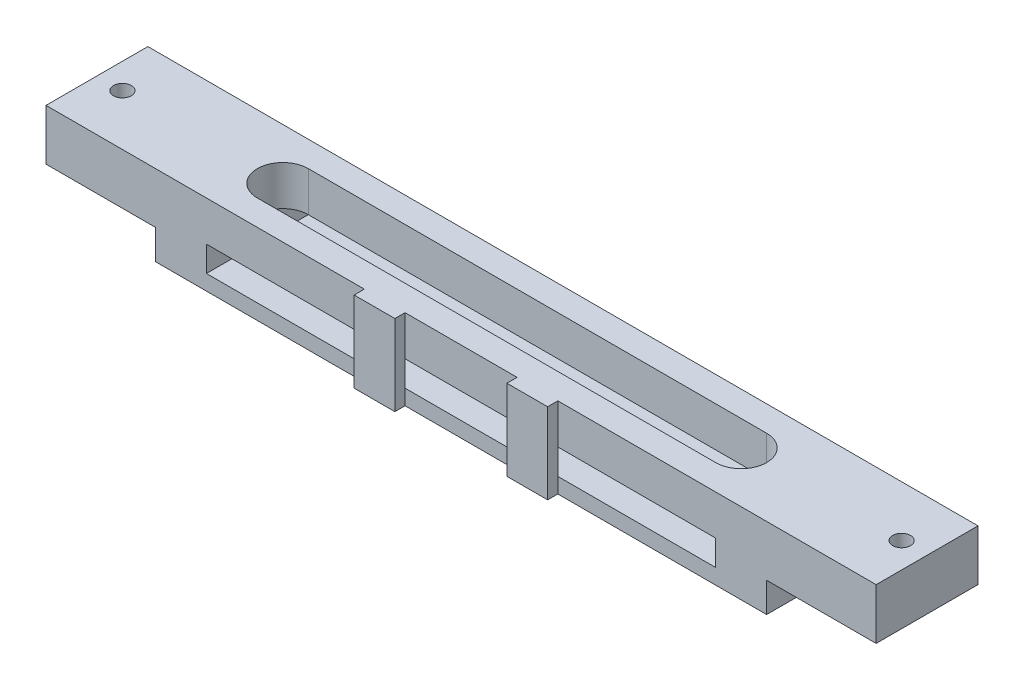
ISO-10303-21;
HEADER;
FILE_DESCRIPTION(('STEP AP214'),'2;1');
FILE_NAME('part.step','',(''),(''),'','','');
FILE_SCHEMA(('AUTOMOTIVE_DESIGN { 1 0 10303 214 1 1 1 1 }'));
ENDSEC;
DATA;
#1=APPLICATION_CONTEXT('core data for automotive mechanical design processes');
#2=APPLICATION_PROTOCOL_DEFINITION('international standard','automotive_design',2000,#1);
#3=PRODUCT_CONTEXT('',#1,'mechanical');
#4=PRODUCT('Part','Part','',(#3));
#5=PRODUCT_RELATED_PRODUCT_CATEGORY('part','',(#4));
#6=PRODUCT_DEFINITION_FORMATION('','',#4);
#7=PRODUCT_DEFINITION_CONTEXT('part definition',#1,'design');
#8=PRODUCT_DEFINITION('design','',#6,#7);
#9=PRODUCT_DEFINITION_SHAPE('','',#8);
#10=(LENGTH_UNIT() NAMED_UNIT(*) SI_UNIT(.MILLI.,.METRE.));
#11=(NAMED_UNIT(*) PLANE_ANGLE_UNIT() SI_UNIT($,.RADIAN.));
#12=(NAMED_UNIT(*) SI_UNIT($,.STERADIAN.) SOLID_ANGLE_UNIT());
#13=UNCERTAINTY_MEASURE_WITH_UNIT(LENGTH_MEASURE(1.E-05),#10,'distance_accuracy_value','');
#14=(GEOMETRIC_REPRESENTATION_CONTEXT(3) GLOBAL_UNCERTAINTY_ASSIGNED_CONTEXT((#13)) GLOBAL_UNIT_ASSIGNED_CONTEXT((#10,
#11,#12)) REPRESENTATION_CONTEXT('',''));
#15=CARTESIAN_POINT('',(0.,0.,0.));
#16=DIRECTION('',(0.,0.,1.));
#17=DIRECTION('',(1.,0.,0.));
#18=AXIS2_PLACEMENT_3D('',#15,#16,#17);
#19=CARTESIAN_POINT('',(0.,0.,20.));
#20=DIRECTION('',(0.,0.,-1.));
#21=DIRECTION('',(-1.,0.,0.));
#22=AXIS2_PLACEMENT_3D('',#19,#20,#21);
#23=PLANE('',#22);
#24=DIRECTION('',(0.,-1.,0.));
#25=VECTOR('',#24,1.);
#26=CARTESIAN_POINT('',(-19.,9.99999999999998,20.));
#27=LINE('',#26,#25);
#28=CARTESIAN_POINT('',(-19.,9.99999999999999,20.));
#29=VERTEX_POINT('',#28);
#30=CARTESIAN_POINT('',(-19.,2.15999999999999,20.));
#31=VERTEX_POINT('',#30);
#32=EDGE_CURVE('E52',#29,#31,#27,.T.);
#33=ORIENTED_EDGE('',*,*,#32,.F.);
#34=DIRECTION('',(-1.,0.,0.));
#35=VECTOR('',#34,1.);
#36=CARTESIAN_POINT('',(-81.5,10.,20.));
#37=LINE('',#36,#35);
#38=CARTESIAN_POINT('',(-81.5,10.,20.));
#39=VERTEX_POINT('',#38);
#40=EDGE_CURVE('E468',#29,#39,#37,.T.);
#41=ORIENTED_EDGE('',*,*,#40,.T.);
#42=DIRECTION('',(0.,-1.,0.));
#43=VECTOR('',#42,1.);
#44=CARTESIAN_POINT('',(-81.5,0.,20.));
#45=LINE('',#44,#43);
#46=CARTESIAN_POINT('',(-81.5,0.,20.));
#47=VERTEX_POINT('',#46);
#48=EDGE_CURVE('E458',#39,#47,#45,.T.);
#49=ORIENTED_EDGE('',*,*,#48,.T.);
#50=DIRECTION('',(1.,0.,0.));
#51=VECTOR('',#50,1.);
#52=CARTESIAN_POINT('',(81.5,0.,20.));
#53=LINE('',#52,#51);
#54=CARTESIAN_POINT('',(-60.,0.,20.));
#55=VERTEX_POINT('',#54);
#56=EDGE_CURVE('E463',#47,#55,#53,.T.);
#57=ORIENTED_EDGE('',*,*,#56,.T.);
#58=DIRECTION('',(0.,1.,0.));
#59=VECTOR('',#58,1.);
#60=CARTESIAN_POINT('',(-60.,-5.84000000000001,20.));
#61=LINE('',#60,#59);
#62=CARTESIAN_POINT('',(-60.,-5.84000000000001,20.));
#63=VERTEX_POINT('',#62);
#64=EDGE_CURVE('E451',#63,#55,#61,.T.);
#65=ORIENTED_EDGE('',*,*,#64,.F.);
#66=DIRECTION('',(-1.,0.,0.));
#67=VECTOR('',#66,1.);
#68=CARTESIAN_POINT('',(-60.,-5.84000000000001,20.));
#69=LINE('',#68,#67);
#70=CARTESIAN_POINT('',(-19.,-5.84,20.));
#71=VERTEX_POINT('',#70);
#72=EDGE_CURVE('E431',#71,#63,#69,.T.);
#73=ORIENTED_EDGE('',*,*,#72,.F.);
#74=CARTESIAN_POINT('',(-19.,-2.84000000000001,20.));
#75=VERTEX_POINT('',#74);
#76=EDGE_CURVE('E11',#75,#71,#27,.T.);
#77=ORIENTED_EDGE('',*,*,#76,.F.);
#78=DIRECTION('',(1.,0.,0.));
#79=VECTOR('',#78,1.);
#80=CARTESIAN_POINT('',(-50.,-2.84000000000001,20.));
#81=LINE('',#80,#79);
#82=CARTESIAN_POINT('',(-50.,-2.84000000000001,20.));
#83=VERTEX_POINT('',#82);
#84=EDGE_CURVE('E370',#83,#75,#81,.T.);
#85=ORIENTED_EDGE('',*,*,#84,.F.);
#86=DIRECTION('',(0.,-1.,0.));
#87=VECTOR('',#86,1.);
#88=CARTESIAN_POINT('',(-50.,2.15999999999999,20.));
#89=LINE('',#88,#87);
#90=CARTESIAN_POINT('',(-50.,2.15999999999999,20.));
#91=VERTEX_POINT('',#90);
#92=EDGE_CURVE('E360',#91,#83,#89,.T.);
#93=ORIENTED_EDGE('',*,*,#92,.F.);
#94=DIRECTION('',(-1.,0.,0.));
#95=VECTOR('',#94,1.);
#96=CARTESIAN_POINT('',(-50.,2.15999999999999,20.));
#97=LINE('',#96,#95);
#98=EDGE_CURVE('E366',#31,#91,#97,.T.);
#99=ORIENTED_EDGE('',*,*,#98,.F.);
#100=EDGE_LOOP('',(#33,#41,#49,#57,#65,#73,#77,#85,#93,#99));
#101=FACE_BOUND('',#100,.T.);
#102=ADVANCED_FACE('F41',(#101),#23,.F.);
#103=DIRECTION('',(0.,1.,0.));
#104=VECTOR('',#103,1.);
#105=CARTESIAN_POINT('',(-11.,9.99999999999998,20.));
#106=LINE('',#105,#104);
#107=CARTESIAN_POINT('',(-11.,-5.84,20.));
#108=VERTEX_POINT('',#107);
#109=CARTESIAN_POINT('',(-11.,-2.84000000000001,20.));
#110=VERTEX_POINT('',#109);
#111=EDGE_CURVE('E281',#108,#110,#106,.T.);
#112=ORIENTED_EDGE('',*,*,#111,.F.);
#113=CARTESIAN_POINT('',(11.,-5.84,20.));
#114=VERTEX_POINT('',#113);
#115=EDGE_CURVE('E437',#114,#108,#69,.T.);
#116=ORIENTED_EDGE('',*,*,#115,.F.);
#117=DIRECTION('',(0.,-1.,0.));
#118=VECTOR('',#117,1.);
#119=CARTESIAN_POINT('',(11.,9.99999999999998,20.));
#120=LINE('',#119,#118);
#121=CARTESIAN_POINT('',(11.,-2.84000000000001,20.));
#122=VERTEX_POINT('',#121);
#123=EDGE_CURVE('E313',#122,#114,#120,.T.);
#124=ORIENTED_EDGE('',*,*,#123,.F.);
#125=EDGE_CURVE('E539',#110,#122,#81,.T.);
#126=ORIENTED_EDGE('',*,*,#125,.F.);
#127=EDGE_LOOP('',(#112,#116,#124,#126));
#128=FACE_BOUND('',#127,.T.);
#129=ADVANCED_FACE('F571',(#128),#23,.F.);
#130=CARTESIAN_POINT('',(-11.,2.15999999999999,20.));
#131=VERTEX_POINT('',#130);
#132=CARTESIAN_POINT('',(-11.,9.99999999999998,20.));
#133=VERTEX_POINT('',#132);
#134=EDGE_CURVE('E50',#131,#133,#106,.T.);
#135=ORIENTED_EDGE('',*,*,#134,.F.);
#136=CARTESIAN_POINT('',(11.,2.15999999999999,20.));
#137=VERTEX_POINT('',#136);
#138=EDGE_CURVE('E513',#137,#131,#97,.T.);
#139=ORIENTED_EDGE('',*,*,#138,.F.);
#140=CARTESIAN_POINT('',(11.,9.99999999999999,20.));
#141=VERTEX_POINT('',#140);
#142=EDGE_CURVE('E67',#141,#137,#120,.T.);
#143=ORIENTED_EDGE('',*,*,#142,.F.);
#144=EDGE_CURVE('E472',#141,#133,#37,.T.);
#145=ORIENTED_EDGE('',*,*,#144,.T.);
#146=EDGE_LOOP('',(#135,#139,#143,#145));
#147=FACE_BOUND('',#146,.T.);
#148=ADVANCED_FACE('F553',(#147),#23,.F.);
#149=DIRECTION('',(0.,1.,0.));
#150=VECTOR('',#149,1.);
#151=CARTESIAN_POINT('',(19.,9.99999999999998,20.));
#152=LINE('',#151,#150);
#153=CARTESIAN_POINT('',(19.,-5.84,20.));
#154=VERTEX_POINT('',#153);
#155=CARTESIAN_POINT('',(19.,-2.84000000000001,20.));
#156=VERTEX_POINT('',#155);
#157=EDGE_CURVE('E306',#154,#156,#152,.T.);
#158=ORIENTED_EDGE('',*,*,#157,.F.);
#159=CARTESIAN_POINT('',(60.,-5.83999999999999,20.));
#160=VERTEX_POINT('',#159);
#161=EDGE_CURVE('E433',#160,#154,#69,.T.);
#162=ORIENTED_EDGE('',*,*,#161,.F.);
#163=DIRECTION('',(0.,1.,0.));
#164=VECTOR('',#163,1.);
#165=CARTESIAN_POINT('',(60.,-5.83999999999999,20.));
#166=LINE('',#165,#164);
#167=CARTESIAN_POINT('',(60.,0.,20.));
#168=VERTEX_POINT('',#167);
#169=EDGE_CURVE('E454',#160,#168,#166,.T.);
#170=ORIENTED_EDGE('',*,*,#169,.T.);
#171=CARTESIAN_POINT('',(81.5,0.,20.));
#172=VERTEX_POINT('',#171);
#173=EDGE_CURVE('E461',#168,#172,#53,.T.);
#174=ORIENTED_EDGE('',*,*,#173,.T.);
#175=DIRECTION('',(0.,1.,0.));
#176=VECTOR('',#175,1.);
#177=CARTESIAN_POINT('',(81.5,0.,20.));
#178=LINE('',#177,#176);
#179=CARTESIAN_POINT('',(81.5,9.99999999999998,20.));
#180=VERTEX_POINT('',#179);
#181=EDGE_CURVE('E466',#172,#180,#178,.T.);
#182=ORIENTED_EDGE('',*,*,#181,.T.);
#183=CARTESIAN_POINT('',(19.,9.99999999999998,20.));
#184=VERTEX_POINT('',#183);
#185=EDGE_CURVE('E469',#180,#184,#37,.T.);
#186=ORIENTED_EDGE('',*,*,#185,.T.);
#187=CARTESIAN_POINT('',(19.,2.15999999999999,20.));
#188=VERTEX_POINT('',#187);
#189=EDGE_CURVE('E311',#188,#184,#152,.T.);
#190=ORIENTED_EDGE('',*,*,#189,.F.);
#191=CARTESIAN_POINT('',(50.,2.15999999999999,20.));
#192=VERTEX_POINT('',#191);
#193=EDGE_CURVE('E361',#192,#188,#97,.T.);
#194=ORIENTED_EDGE('',*,*,#193,.F.);
#195=DIRECTION('',(0.,1.,0.));
#196=VECTOR('',#195,1.);
#197=CARTESIAN_POINT('',(50.,2.15999999999999,20.));
#198=LINE('',#197,#196);
#199=CARTESIAN_POINT('',(50.,-2.84000000000001,20.));
#200=VERTEX_POINT('',#199);
#201=EDGE_CURVE('E367',#200,#192,#198,.T.);
#202=ORIENTED_EDGE('',*,*,#201,.F.);
#203=EDGE_CURVE('E374',#156,#200,#81,.T.);
#204=ORIENTED_EDGE('',*,*,#203,.F.);
#205=EDGE_LOOP('',(#158,#162,#170,#174,#182,#186,#190,#194,#202,#204));
#206=FACE_BOUND('',#205,.T.);
#207=ADVANCED_FACE('F581',(#206),#23,.F.);
#208=CARTESIAN_POINT('',(-50.,2.15999999999999,-100.124921972504));
#209=DIRECTION('',(0.,1.,0.));
#210=DIRECTION('',(0.,0.,1.));
#211=AXIS2_PLACEMENT_3D('',#208,#209,#210);
#212=PLANE('',#211);
#213=DIRECTION('',(1.,0.,0.));
#214=VECTOR('',#213,1.);
#215=CARTESIAN_POINT('',(-45.,2.15999999999999,5.));
#216=LINE('',#215,#214);
#217=CARTESIAN_POINT('',(-45.,2.15999999999999,4.99999999999999));
#218=VERTEX_POINT('',#217);
#219=CARTESIAN_POINT('',(45.,2.15999999999999,5.));
#220=VERTEX_POINT('',#219);
#221=EDGE_CURVE('E330',#218,#220,#216,.T.);
#222=ORIENTED_EDGE('',*,*,#221,.F.);
#223=CARTESIAN_POINT('',(-45.,2.15999999999999,10.));
#224=DIRECTION('',(0.,-1.,0.));
#225=DIRECTION('',(0.,0.,-1.));
#226=AXIS2_PLACEMENT_3D('',#223,#224,#225);
#227=CIRCLE('',#226,4.99999999999999);
#228=CARTESIAN_POINT('',(-50.,2.15999999999999,10.));
#229=VERTEX_POINT('',#228);
#230=EDGE_CURVE('E327',#229,#218,#227,.T.);
#231=ORIENTED_EDGE('',*,*,#230,.F.);
#232=DIRECTION('',(0.,0.,1.));
#233=VECTOR('',#232,1.);
#234=CARTESIAN_POINT('',(-50.,2.15999999999999,-100.124921972504));
#235=LINE('',#234,#233);
#236=CARTESIAN_POINT('',(-50.,2.15999999999999,0.));
#237=VERTEX_POINT('',#236);
#238=EDGE_CURVE('E384',#237,#229,#235,.T.);
#239=ORIENTED_EDGE('',*,*,#238,.F.);
#240=DIRECTION('',(-1.,0.,0.));
#241=VECTOR('',#240,1.);
#242=CARTESIAN_POINT('',(-50.,2.15999999999999,0.));
#243=LINE('',#242,#241);
#244=CARTESIAN_POINT('',(50.,2.15999999999999,0.));
#245=VERTEX_POINT('',#244);
#246=EDGE_CURVE('E385',#245,#237,#243,.T.);
#247=ORIENTED_EDGE('',*,*,#246,.F.);
#248=DIRECTION('',(0.,0.,1.));
#249=VECTOR('',#248,1.);
#250=CARTESIAN_POINT('',(50.,2.15999999999999,-100.124921972504));
#251=LINE('',#250,#249);
#252=CARTESIAN_POINT('',(50.,2.15999999999999,10.));
#253=VERTEX_POINT('',#252);
#254=EDGE_CURVE('E389',#245,#253,#251,.T.);
#255=ORIENTED_EDGE('',*,*,#254,.T.);
#256=CARTESIAN_POINT('',(45.,2.15999999999999,10.));
#257=DIRECTION('',(0.,-1.,0.));
#258=DIRECTION('',(0.,0.,-1.));
#259=AXIS2_PLACEMENT_3D('',#256,#257,#258);
#260=CIRCLE('',#259,5.);
#261=EDGE_CURVE('E334',#220,#253,#260,.T.);
#262=ORIENTED_EDGE('',*,*,#261,.F.);
#263=EDGE_LOOP('',(#222,#231,#239,#247,#255,#262));
#264=FACE_BOUND('',#263,.T.);
#265=ADVANCED_FACE('F588',(#264),#212,.F.);
#266=CARTESIAN_POINT('',(81.5,0.,20.));
#267=DIRECTION('',(0.,1.,0.));
#268=DIRECTION('',(-1.,0.,0.));
#269=AXIS2_PLACEMENT_3D('',#266,#267,#268);
#270=PLANE('',#269);
#271=CARTESIAN_POINT('',(76.5,0.,10.));
#272=DIRECTION('',(0.,1.,0.));
#273=DIRECTION('',(-1.,0.,0.));
#274=AXIS2_PLACEMENT_3D('',#271,#272,#273);
#275=CIRCLE('',#274,1.75);
#276=CARTESIAN_POINT('',(74.75,0.,10.));
#277=VERTEX_POINT('',#276);
#278=EDGE_CURVE('E324',#277,#277,#275,.T.);
#279=ORIENTED_EDGE('',*,*,#278,.T.);
#280=EDGE_LOOP('',(#279));
#281=FACE_BOUND('',#280,.T.);
#282=DIRECTION('',(0.,0.,1.));
#283=VECTOR('',#282,1.);
#284=CARTESIAN_POINT('',(60.,0.,20.));
#285=LINE('',#284,#283);
#286=CARTESIAN_POINT('',(60.,0.,0.));
#287=VERTEX_POINT('',#286);
#288=EDGE_CURVE('E428',#287,#168,#285,.T.);
#289=ORIENTED_EDGE('',*,*,#288,.F.);
#290=DIRECTION('',(1.,0.,0.));
#291=VECTOR('',#290,1.);
#292=CARTESIAN_POINT('',(81.5,0.,0.));
#293=LINE('',#292,#291);
#294=CARTESIAN_POINT('',(81.5,0.,0.));
#295=VERTEX_POINT('',#294);
#296=EDGE_CURVE('E475',#287,#295,#293,.T.);
#297=ORIENTED_EDGE('',*,*,#296,.T.);
#298=DIRECTION('',(0.,0.,-1.));
#299=VECTOR('',#298,1.);
#300=CARTESIAN_POINT('',(81.5,0.,20.));
#301=LINE('',#300,#299);
#302=EDGE_CURVE('E486',#172,#295,#301,.T.);
#303=ORIENTED_EDGE('',*,*,#302,.F.);
#304=ORIENTED_EDGE('',*,*,#173,.F.);
#305=EDGE_LOOP('',(#289,#297,#303,#304));
#306=FACE_BOUND('',#305,.T.);
#307=ADVANCED_FACE('F616',(#281,#306),#270,.F.);
#308=CARTESIAN_POINT('',(-76.5,0.,10.));
#309=DIRECTION('',(0.,1.,0.));
#310=DIRECTION('',(-1.,0.,0.));
#311=AXIS2_PLACEMENT_3D('',#308,#309,#310);
#312=CIRCLE('',#311,1.75);
#313=CARTESIAN_POINT('',(-78.25,0.,10.));
#314=VERTEX_POINT('',#313);
#315=EDGE_CURVE('E288',#314,#314,#312,.T.);
#316=ORIENTED_EDGE('',*,*,#315,.T.);
#317=EDGE_LOOP('',(#316));
#318=FACE_BOUND('',#317,.T.);
#319=DIRECTION('',(0.,0.,-1.));
#320=VECTOR('',#319,1.);
#321=CARTESIAN_POINT('',(-60.,0.,20.));
#322=LINE('',#321,#320);
#323=CARTESIAN_POINT('',(-60.,0.,0.));
#324=VERTEX_POINT('',#323);
#325=EDGE_CURVE('E432',#55,#324,#322,.T.);
#326=ORIENTED_EDGE('',*,*,#325,.F.);
#327=ORIENTED_EDGE('',*,*,#56,.F.);
#328=DIRECTION('',(0.,0.,-1.));
#329=VECTOR('',#328,1.);
#330=CARTESIAN_POINT('',(-81.5,0.,20.));
#331=LINE('',#330,#329);
#332=CARTESIAN_POINT('',(-81.5,0.,0.));
#333=VERTEX_POINT('',#332);
#334=EDGE_CURVE('E489',#47,#333,#331,.T.);
#335=ORIENTED_EDGE('',*,*,#334,.T.);
#336=EDGE_CURVE('E476',#333,#324,#293,.T.);
#337=ORIENTED_EDGE('',*,*,#336,.T.);
#338=EDGE_LOOP('',(#326,#327,#335,#337));
#339=FACE_BOUND('',#338,.T.);
#340=ADVANCED_FACE('F561',(#318,#339),#270,.F.);
#341=CARTESIAN_POINT('',(-81.5,0.,20.));
#342=DIRECTION('',(1.,0.,0.));
#343=DIRECTION('',(0.,0.,-1.));
#344=AXIS2_PLACEMENT_3D('',#341,#342,#343);
#345=PLANE('',#344);
#346=DIRECTION('',(0.,-1.,0.));
#347=VECTOR('',#346,1.);
#348=CARTESIAN_POINT('',(-81.5,0.,0.));
#349=LINE('',#348,#347);
#350=CARTESIAN_POINT('',(-81.5,10.,0.));
#351=VERTEX_POINT('',#350);
#352=EDGE_CURVE('E457',#351,#333,#349,.T.);
#353=ORIENTED_EDGE('',*,*,#352,.T.);
#354=ORIENTED_EDGE('',*,*,#334,.F.);
#355=ORIENTED_EDGE('',*,*,#48,.F.);
#356=DIRECTION('',(0.,0.,-1.));
#357=VECTOR('',#356,1.);
#358=CARTESIAN_POINT('',(-81.5,10.,20.));
#359=LINE('',#358,#357);
#360=EDGE_CURVE('E471',#39,#351,#359,.T.);
#361=ORIENTED_EDGE('',*,*,#360,.T.);
#362=EDGE_LOOP('',(#353,#354,#355,#361));
#363=FACE_BOUND('',#362,.T.);
#364=ADVANCED_FACE('F43',(#363),#345,.F.);
#365=CARTESIAN_POINT('',(81.5,0.,20.));
#366=DIRECTION('',(-1.,0.,0.));
#367=DIRECTION('',(0.,0.,1.));
#368=AXIS2_PLACEMENT_3D('',#365,#366,#367);
#369=PLANE('',#368);
#370=DIRECTION('',(0.,1.,0.));
#371=VECTOR('',#370,1.);
#372=CARTESIAN_POINT('',(81.5,0.,0.));
#373=LINE('',#372,#371);
#374=CARTESIAN_POINT('',(81.5,9.99999999999998,0.));
#375=VERTEX_POINT('',#374);
#376=EDGE_CURVE('E478',#295,#375,#373,.T.);
#377=ORIENTED_EDGE('',*,*,#376,.T.);
#378=DIRECTION('',(0.,0.,-1.));
#379=VECTOR('',#378,1.);
#380=CARTESIAN_POINT('',(81.5,9.99999999999998,20.));
#381=LINE('',#380,#379);
#382=EDGE_CURVE('E483',#180,#375,#381,.T.);
#383=ORIENTED_EDGE('',*,*,#382,.F.);
#384=ORIENTED_EDGE('',*,*,#181,.F.);
#385=ORIENTED_EDGE('',*,*,#302,.T.);
#386=EDGE_LOOP('',(#377,#383,#384,#385));
#387=FACE_BOUND('',#386,.T.);
#388=ADVANCED_FACE('F614',(#387),#369,.F.);
#389=CARTESIAN_POINT('',(-81.5,10.,20.));
#390=DIRECTION('',(0.,-1.,0.));
#391=DIRECTION('',(1.,0.,0.));
#392=AXIS2_PLACEMENT_3D('',#389,#390,#391);
#393=PLANE('',#392);
#394=CARTESIAN_POINT('',(76.5,9.99999999999998,10.));
#395=DIRECTION('',(0.,-1.,0.));
#396=DIRECTION('',(1.,0.,0.));
#397=AXIS2_PLACEMENT_3D('',#394,#395,#396);
#398=CIRCLE('',#397,1.75);
#399=CARTESIAN_POINT('',(78.25,9.99999999999998,10.));
#400=VERTEX_POINT('',#399);
#401=EDGE_CURVE('E45',#400,#400,#398,.T.);
#402=ORIENTED_EDGE('',*,*,#401,.T.);
#403=EDGE_LOOP('',(#402));
#404=FACE_BOUND('',#403,.T.);
#405=CARTESIAN_POINT('',(-76.5,10.,10.));
#406=DIRECTION('',(0.,-1.,0.));
#407=DIRECTION('',(1.,0.,0.));
#408=AXIS2_PLACEMENT_3D('',#405,#406,#407);
#409=CIRCLE('',#408,1.75);
#410=CARTESIAN_POINT('',(-74.75,10.,10.));
#411=VERTEX_POINT('',#410);
#412=EDGE_CURVE('E285',#411,#411,#409,.T.);
#413=ORIENTED_EDGE('',*,*,#412,.T.);
#414=EDGE_LOOP('',(#413));
#415=FACE_BOUND('',#414,.T.);
#416=DIRECTION('',(-1.,0.,0.));
#417=VECTOR('',#416,1.);
#418=CARTESIAN_POINT('',(-81.5,10.,15.));
#419=LINE('',#418,#417);
#420=CARTESIAN_POINT('',(45.,9.99999999999998,15.));
#421=VERTEX_POINT('',#420);
#422=CARTESIAN_POINT('',(-45.,9.99999999999999,15.));
#423=VERTEX_POINT('',#422);
#424=EDGE_CURVE('E354',#421,#423,#419,.T.);
#425=ORIENTED_EDGE('',*,*,#424,.T.);
#426=CARTESIAN_POINT('',(-45.,9.99999999999999,10.));
#427=DIRECTION('',(0.,-1.,0.));
#428=DIRECTION('',(1.,0.,0.));
#429=AXIS2_PLACEMENT_3D('',#426,#427,#428);
#430=CIRCLE('',#429,4.99999999999999);
#431=CARTESIAN_POINT('',(-45.,9.99999999999999,5.));
#432=VERTEX_POINT('',#431);
#433=EDGE_CURVE('E357',#423,#432,#430,.T.);
#434=ORIENTED_EDGE('',*,*,#433,.T.);
#435=DIRECTION('',(1.,0.,0.));
#436=VECTOR('',#435,1.);
#437=CARTESIAN_POINT('',(-81.5,10.,4.99999999999999));
#438=LINE('',#437,#436);
#439=CARTESIAN_POINT('',(45.,9.99999999999998,5.));
#440=VERTEX_POINT('',#439);
#441=EDGE_CURVE('E342',#432,#440,#438,.T.);
#442=ORIENTED_EDGE('',*,*,#441,.T.);
#443=CARTESIAN_POINT('',(45.,9.99999999999998,10.));
#444=DIRECTION('',(0.,-1.,0.));
#445=DIRECTION('',(1.,0.,0.));
#446=AXIS2_PLACEMENT_3D('',#443,#444,#445);
#447=CIRCLE('',#446,5.);
#448=EDGE_CURVE('E351',#440,#421,#447,.T.);
#449=ORIENTED_EDGE('',*,*,#448,.T.);
#450=EDGE_LOOP('',(#425,#434,#442,#449));
#451=FACE_BOUND('',#450,.T.);
#452=DIRECTION('',(-1.,0.,0.));
#453=VECTOR('',#452,1.);
#454=CARTESIAN_POINT('',(-81.5,10.,0.));
#455=LINE('',#454,#453);
#456=EDGE_CURVE('E462',#375,#351,#455,.T.);
#457=ORIENTED_EDGE('',*,*,#456,.T.);
#458=ORIENTED_EDGE('',*,*,#360,.F.);
#459=ORIENTED_EDGE('',*,*,#40,.F.);
#460=DIRECTION('',(0.,0.,-1.));
#461=VECTOR('',#460,1.);
#462=CARTESIAN_POINT('',(-19.,9.99999999999998,22.));
#463=LINE('',#462,#461);
#464=CARTESIAN_POINT('',(-19.,9.99999999999998,22.));
#465=VERTEX_POINT('',#464);
#466=EDGE_CURVE('E544',#465,#29,#463,.T.);
#467=ORIENTED_EDGE('',*,*,#466,.F.);
#468=DIRECTION('',(-1.,0.,0.));
#469=VECTOR('',#468,1.);
#470=CARTESIAN_POINT('',(-19.,9.99999999999998,22.));
#471=LINE('',#470,#469);
#472=CARTESIAN_POINT('',(-11.,9.99999999999998,22.));
#473=VERTEX_POINT('',#472);
#474=EDGE_CURVE('E277',#473,#465,#471,.T.);
#475=ORIENTED_EDGE('',*,*,#474,.F.);
#476=DIRECTION('',(0.,0.,-1.));
#477=VECTOR('',#476,1.);
#478=CARTESIAN_POINT('',(-11.,9.99999999999998,22.));
#479=LINE('',#478,#477);
#480=EDGE_CURVE('E289',#473,#133,#479,.T.);
#481=ORIENTED_EDGE('',*,*,#480,.T.);
#482=ORIENTED_EDGE('',*,*,#144,.F.);
#483=DIRECTION('',(0.,0.,-1.));
#484=VECTOR('',#483,1.);
#485=CARTESIAN_POINT('',(11.,9.99999999999998,22.));
#486=LINE('',#485,#484);
#487=CARTESIAN_POINT('',(11.,9.99999999999998,22.));
#488=VERTEX_POINT('',#487);
#489=EDGE_CURVE('E302',#488,#141,#486,.T.);
#490=ORIENTED_EDGE('',*,*,#489,.F.);
#491=DIRECTION('',(-1.,0.,0.));
#492=VECTOR('',#491,1.);
#493=CARTESIAN_POINT('',(11.,9.99999999999998,22.));
#494=LINE('',#493,#492);
#495=CARTESIAN_POINT('',(19.,9.99999999999998,22.));
#496=VERTEX_POINT('',#495);
#497=EDGE_CURVE('E305',#496,#488,#494,.T.);
#498=ORIENTED_EDGE('',*,*,#497,.F.);
#499=DIRECTION('',(0.,0.,-1.));
#500=VECTOR('',#499,1.);
#501=CARTESIAN_POINT('',(19.,9.99999999999998,22.));
#502=LINE('',#501,#500);
#503=EDGE_CURVE('E299',#496,#184,#502,.T.);
#504=ORIENTED_EDGE('',*,*,#503,.T.);
#505=ORIENTED_EDGE('',*,*,#185,.F.);
#506=ORIENTED_EDGE('',*,*,#382,.T.);
#507=EDGE_LOOP('',(#457,#458,#459,#467,#475,#481,#482,#490,#498,#504,#505,#506));
#508=FACE_BOUND('',#507,.T.);
#509=ADVANCED_FACE('F548',(#404,#415,#451,#508),#393,.F.);
#510=CARTESIAN_POINT('',(0.,0.,0.));
#511=DIRECTION('',(0.,0.,-1.));
#512=DIRECTION('',(-1.,0.,0.));
#513=AXIS2_PLACEMENT_3D('',#510,#511,#512);
#514=PLANE('',#513);
#515=DIRECTION('',(1.,0.,0.));
#516=VECTOR('',#515,1.);
#517=CARTESIAN_POINT('',(-50.,-2.84000000000001,0.));
#518=LINE('',#517,#516);
#519=CARTESIAN_POINT('',(-50.,-2.84000000000001,0.));
#520=VERTEX_POINT('',#519);
#521=CARTESIAN_POINT('',(50.,-2.84000000000001,0.));
#522=VERTEX_POINT('',#521);
#523=EDGE_CURVE('E364',#520,#522,#518,.T.);
#524=ORIENTED_EDGE('',*,*,#523,.T.);
#525=DIRECTION('',(0.,1.,0.));
#526=VECTOR('',#525,1.);
#527=CARTESIAN_POINT('',(50.,2.15999999999999,0.));
#528=LINE('',#527,#526);
#529=EDGE_CURVE('E390',#522,#245,#528,.T.);
#530=ORIENTED_EDGE('',*,*,#529,.T.);
#531=ORIENTED_EDGE('',*,*,#246,.T.);
#532=DIRECTION('',(0.,-1.,0.));
#533=VECTOR('',#532,1.);
#534=CARTESIAN_POINT('',(-50.,2.15999999999999,0.));
#535=LINE('',#534,#533);
#536=EDGE_CURVE('E380',#237,#520,#535,.T.);
#537=ORIENTED_EDGE('',*,*,#536,.T.);
#538=EDGE_LOOP('',(#524,#530,#531,#537));
#539=FACE_BOUND('',#538,.T.);
#540=ORIENTED_EDGE('',*,*,#352,.F.);
#541=ORIENTED_EDGE('',*,*,#456,.F.);
#542=ORIENTED_EDGE('',*,*,#376,.F.);
#543=ORIENTED_EDGE('',*,*,#296,.F.);
#544=DIRECTION('',(0.,1.,0.));
#545=VECTOR('',#544,1.);
#546=CARTESIAN_POINT('',(60.,-5.83999999999999,0.));
#547=LINE('',#546,#545);
#548=CARTESIAN_POINT('',(60.,-5.83999999999999,0.));
#549=VERTEX_POINT('',#548);
#550=EDGE_CURVE('E441',#549,#287,#547,.T.);
#551=ORIENTED_EDGE('',*,*,#550,.F.);
#552=DIRECTION('',(1.,0.,0.));
#553=VECTOR('',#552,1.);
#554=CARTESIAN_POINT('',(-60.,-5.84000000000001,0.));
#555=LINE('',#554,#553);
#556=CARTESIAN_POINT('',(-60.,-5.84000000000001,0.));
#557=VERTEX_POINT('',#556);
#558=EDGE_CURVE('E439',#557,#549,#555,.T.);
#559=ORIENTED_EDGE('',*,*,#558,.F.);
#560=DIRECTION('',(0.,1.,0.));
#561=VECTOR('',#560,1.);
#562=CARTESIAN_POINT('',(-60.,-5.84000000000001,0.));
#563=LINE('',#562,#561);
#564=EDGE_CURVE('E448',#557,#324,#563,.T.);
#565=ORIENTED_EDGE('',*,*,#564,.T.);
#566=ORIENTED_EDGE('',*,*,#336,.F.);
#567=EDGE_LOOP('',(#540,#541,#542,#543,#551,#559,#565,#566));
#568=FACE_BOUND('',#567,.T.);
#569=ADVANCED_FACE('F591',(#539,#568),#514,.T.);
#570=CARTESIAN_POINT('',(0.,-5.84,0.));
#571=DIRECTION('',(0.,-1.,0.));
#572=DIRECTION('',(1.,0.,0.));
#573=AXIS2_PLACEMENT_3D('',#570,#571,#572);
#574=PLANE('',#573);
#575=DIRECTION('',(0.,0.,1.));
#576=VECTOR('',#575,1.);
#577=CARTESIAN_POINT('',(60.,-5.83999999999999,20.));
#578=LINE('',#577,#576);
#579=EDGE_CURVE('E429',#549,#160,#578,.T.);
#580=ORIENTED_EDGE('',*,*,#579,.T.);
#581=ORIENTED_EDGE('',*,*,#161,.T.);
#582=DIRECTION('',(0.,0.,-1.));
#583=VECTOR('',#582,1.);
#584=CARTESIAN_POINT('',(19.,-5.83999999999999,22.));
#585=LINE('',#584,#583);
#586=CARTESIAN_POINT('',(19.,-5.83999999999999,22.));
#587=VERTEX_POINT('',#586);
#588=EDGE_CURVE('E296',#587,#154,#585,.T.);
#589=ORIENTED_EDGE('',*,*,#588,.F.);
#590=DIRECTION('',(1.,0.,0.));
#591=VECTOR('',#590,1.);
#592=CARTESIAN_POINT('',(11.,-5.83999999999999,22.));
#593=LINE('',#592,#591);
#594=CARTESIAN_POINT('',(11.,-5.83999999999999,22.));
#595=VERTEX_POINT('',#594);
#596=EDGE_CURVE('E317',#595,#587,#593,.T.);
#597=ORIENTED_EDGE('',*,*,#596,.F.);
#598=DIRECTION('',(0.,0.,-1.));
#599=VECTOR('',#598,1.);
#600=CARTESIAN_POINT('',(11.,-5.83999999999999,22.));
#601=LINE('',#600,#599);
#602=EDGE_CURVE('E293',#595,#114,#601,.T.);
#603=ORIENTED_EDGE('',*,*,#602,.T.);
#604=ORIENTED_EDGE('',*,*,#115,.T.);
#605=DIRECTION('',(0.,0.,-1.));
#606=VECTOR('',#605,1.);
#607=CARTESIAN_POINT('',(-11.,-5.83999999999999,22.));
#608=LINE('',#607,#606);
#609=CARTESIAN_POINT('',(-11.,-5.83999999999999,22.));
#610=VERTEX_POINT('',#609);
#611=EDGE_CURVE('E268',#610,#108,#608,.T.);
#612=ORIENTED_EDGE('',*,*,#611,.F.);
#613=DIRECTION('',(1.,0.,0.));
#614=VECTOR('',#613,1.);
#615=CARTESIAN_POINT('',(-19.,-5.83999999999999,22.));
#616=LINE('',#615,#614);
#617=CARTESIAN_POINT('',(-19.,-5.83999999999999,22.));
#618=VERTEX_POINT('',#617);
#619=EDGE_CURVE('E259',#618,#610,#616,.T.);
#620=ORIENTED_EDGE('',*,*,#619,.F.);
#621=DIRECTION('',(0.,0.,-1.));
#622=VECTOR('',#621,1.);
#623=CARTESIAN_POINT('',(-19.,-5.83999999999999,22.));
#624=LINE('',#623,#622);
#625=EDGE_CURVE('E265',#618,#71,#624,.T.);
#626=ORIENTED_EDGE('',*,*,#625,.T.);
#627=ORIENTED_EDGE('',*,*,#72,.T.);
#628=DIRECTION('',(0.,0.,-1.));
#629=VECTOR('',#628,1.);
#630=CARTESIAN_POINT('',(-60.,-5.84000000000001,20.));
#631=LINE('',#630,#629);
#632=EDGE_CURVE('E436',#63,#557,#631,.T.);
#633=ORIENTED_EDGE('',*,*,#632,.T.);
#634=ORIENTED_EDGE('',*,*,#558,.T.);
#635=EDGE_LOOP('',(#580,#581,#589,#597,#603,#604,#612,#620,#626,#627,#633,#634));
#636=FACE_BOUND('',#635,.T.);
#637=DIRECTION('',(1.,0.,0.));
#638=VECTOR('',#637,1.);
#639=CARTESIAN_POINT('',(-45.,-5.84000000000001,7.65));
#640=LINE('',#639,#638);
#641=CARTESIAN_POINT('',(-45.,-5.84000000000001,7.65));
#642=VERTEX_POINT('',#641);
#643=CARTESIAN_POINT('',(45.,-5.83999999999999,7.65));
#644=VERTEX_POINT('',#643);
#645=EDGE_CURVE('E409',#642,#644,#640,.T.);
#646=ORIENTED_EDGE('',*,*,#645,.F.);
#647=CARTESIAN_POINT('',(-45.,-5.84000000000001,10.));
#648=DIRECTION('',(0.,-1.,0.));
#649=DIRECTION('',(1.,0.,0.));
#650=AXIS2_PLACEMENT_3D('',#647,#648,#649);
#651=CIRCLE('',#650,2.35);
#652=CARTESIAN_POINT('',(-45.,-5.84000000000001,12.35));
#653=VERTEX_POINT('',#652);
#654=EDGE_CURVE('E407',#653,#642,#651,.T.);
#655=ORIENTED_EDGE('',*,*,#654,.F.);
#656=DIRECTION('',(-1.,0.,0.));
#657=VECTOR('',#656,1.);
#658=CARTESIAN_POINT('',(-45.,-5.84000000000001,12.35));
#659=LINE('',#658,#657);
#660=CARTESIAN_POINT('',(45.,-5.83999999999999,12.35));
#661=VERTEX_POINT('',#660);
#662=EDGE_CURVE('E414',#661,#653,#659,.T.);
#663=ORIENTED_EDGE('',*,*,#662,.F.);
#664=CARTESIAN_POINT('',(45.,-5.83999999999999,10.));
#665=DIRECTION('',(0.,-1.,0.));
#666=DIRECTION('',(1.,0.,0.));
#667=AXIS2_PLACEMENT_3D('',#664,#665,#666);
#668=CIRCLE('',#667,2.35);
#669=EDGE_CURVE('E411',#644,#661,#668,.T.);
#670=ORIENTED_EDGE('',*,*,#669,.F.);
#671=EDGE_LOOP('',(#646,#655,#663,#670));
#672=FACE_BOUND('',#671,.T.);
#673=ADVANCED_FACE('F262',(#636,#672),#574,.T.);
#674=CARTESIAN_POINT('',(60.,-5.83999999999999,20.));
#675=DIRECTION('',(-1.,0.,0.));
#676=DIRECTION('',(0.,-1.,0.));
#677=AXIS2_PLACEMENT_3D('',#674,#675,#676);
#678=PLANE('',#677);
#679=ORIENTED_EDGE('',*,*,#288,.T.);
#680=ORIENTED_EDGE('',*,*,#169,.F.);
#681=ORIENTED_EDGE('',*,*,#579,.F.);
#682=ORIENTED_EDGE('',*,*,#550,.T.);
#683=EDGE_LOOP('',(#679,#680,#681,#682));
#684=FACE_BOUND('',#683,.T.);
#685=ADVANCED_FACE('F600',(#684),#678,.F.);
#686=CARTESIAN_POINT('',(-60.,-5.84000000000001,20.));
#687=DIRECTION('',(1.,0.,0.));
#688=DIRECTION('',(0.,1.,0.));
#689=AXIS2_PLACEMENT_3D('',#686,#687,#688);
#690=PLANE('',#689);
#691=ORIENTED_EDGE('',*,*,#325,.T.);
#692=ORIENTED_EDGE('',*,*,#564,.F.);
#693=ORIENTED_EDGE('',*,*,#632,.F.);
#694=ORIENTED_EDGE('',*,*,#64,.T.);
#695=EDGE_LOOP('',(#691,#692,#693,#694));
#696=FACE_BOUND('',#695,.T.);
#697=ADVANCED_FACE('F565',(#696),#690,.F.);
#698=CARTESIAN_POINT('',(-45.,-5.84000000000001,10.));
#699=DIRECTION('',(0.,1.,0.));
#700=DIRECTION('',(-1.,0.,0.));
#701=AXIS2_PLACEMENT_3D('',#698,#699,#700);
#702=CYLINDRICAL_SURFACE('',#701,2.35);
#703=CARTESIAN_POINT('',(-45.,-2.84000000000001,10.));
#704=DIRECTION('',(0.,-1.,0.));
#705=DIRECTION('',(1.,0.,0.));
#706=AXIS2_PLACEMENT_3D('',#703,#704,#705);
#707=CIRCLE('',#706,2.35);
#708=CARTESIAN_POINT('',(-45.,-2.84000000000001,12.35));
#709=VERTEX_POINT('',#708);
#710=CARTESIAN_POINT('',(-45.,-2.84000000000001,7.65));
#711=VERTEX_POINT('',#710);
#712=EDGE_CURVE('E405',#709,#711,#707,.T.);
#713=ORIENTED_EDGE('',*,*,#712,.F.);
#714=DIRECTION('',(0.,1.,0.));
#715=VECTOR('',#714,1.);
#716=CARTESIAN_POINT('',(-45.,-5.84000000000001,12.35));
#717=LINE('',#716,#715);
#718=EDGE_CURVE('E416',#653,#709,#717,.T.);
#719=ORIENTED_EDGE('',*,*,#718,.F.);
#720=ORIENTED_EDGE('',*,*,#654,.T.);
#721=DIRECTION('',(0.,1.,0.));
#722=VECTOR('',#721,1.);
#723=CARTESIAN_POINT('',(-45.,-5.84000000000001,7.65));
#724=LINE('',#723,#722);
#725=EDGE_CURVE('E425',#642,#711,#724,.T.);
#726=ORIENTED_EDGE('',*,*,#725,.T.);
#727=EDGE_LOOP('',(#713,#719,#720,#726));
#728=FACE_BOUND('',#727,.T.);
#729=ADVANCED_FACE('F780',(#728),#702,.F.);
#730=CARTESIAN_POINT('',(-45.,-5.84000000000001,7.65));
#731=DIRECTION('',(0.,0.,1.));
#732=DIRECTION('',(1.,0.,0.));
#733=AXIS2_PLACEMENT_3D('',#730,#731,#732);
#734=PLANE('',#733);
#735=DIRECTION('',(1.,0.,0.));
#736=VECTOR('',#735,1.);
#737=CARTESIAN_POINT('',(-45.,-2.84000000000001,7.65));
#738=LINE('',#737,#736);
#739=CARTESIAN_POINT('',(45.,-2.84000000000001,7.65));
#740=VERTEX_POINT('',#739);
#741=EDGE_CURVE('E403',#711,#740,#738,.T.);
#742=ORIENTED_EDGE('',*,*,#741,.F.);
#743=ORIENTED_EDGE('',*,*,#725,.F.);
#744=ORIENTED_EDGE('',*,*,#645,.T.);
#745=DIRECTION('',(0.,1.,0.));
#746=VECTOR('',#745,1.);
#747=CARTESIAN_POINT('',(45.,-5.83999999999999,7.65));
#748=LINE('',#747,#746);
#749=EDGE_CURVE('E422',#644,#740,#748,.T.);
#750=ORIENTED_EDGE('',*,*,#749,.T.);
#751=EDGE_LOOP('',(#742,#743,#744,#750));
#752=FACE_BOUND('',#751,.T.);
#753=ADVANCED_FACE('F789',(#752),#734,.T.);
#754=CARTESIAN_POINT('',(45.,-5.83999999999999,10.));
#755=DIRECTION('',(0.,1.,0.));
#756=DIRECTION('',(-1.,0.,0.));
#757=AXIS2_PLACEMENT_3D('',#754,#755,#756);
#758=CYLINDRICAL_SURFACE('',#757,2.35);
#759=CARTESIAN_POINT('',(45.,-2.84000000000001,10.));
#760=DIRECTION('',(0.,-1.,0.));
#761=DIRECTION('',(1.,0.,0.));
#762=AXIS2_PLACEMENT_3D('',#759,#760,#761);
#763=CIRCLE('',#762,2.35);
#764=CARTESIAN_POINT('',(45.,-2.84000000000001,12.35));
#765=VERTEX_POINT('',#764);
#766=EDGE_CURVE('E401',#740,#765,#763,.T.);
#767=ORIENTED_EDGE('',*,*,#766,.F.);
#768=ORIENTED_EDGE('',*,*,#749,.F.);
#769=ORIENTED_EDGE('',*,*,#669,.T.);
#770=DIRECTION('',(0.,1.,0.));
#771=VECTOR('',#770,1.);
#772=CARTESIAN_POINT('',(45.,-5.83999999999999,12.35));
#773=LINE('',#772,#771);
#774=EDGE_CURVE('E419',#661,#765,#773,.T.);
#775=ORIENTED_EDGE('',*,*,#774,.T.);
#776=EDGE_LOOP('',(#767,#768,#769,#775));
#777=FACE_BOUND('',#776,.T.);
#778=ADVANCED_FACE('F799',(#777),#758,.F.);
#779=CARTESIAN_POINT('',(-45.,-5.84000000000001,12.35));
#780=DIRECTION('',(0.,0.,-1.));
#781=DIRECTION('',(-1.,0.,0.));
#782=AXIS2_PLACEMENT_3D('',#779,#780,#781);
#783=PLANE('',#782);
#784=DIRECTION('',(-1.,0.,0.));
#785=VECTOR('',#784,1.);
#786=CARTESIAN_POINT('',(-45.,-2.84000000000001,12.35));
#787=LINE('',#786,#785);
#788=EDGE_CURVE('E492',#765,#709,#787,.T.);
#789=ORIENTED_EDGE('',*,*,#788,.F.);
#790=ORIENTED_EDGE('',*,*,#774,.F.);
#791=ORIENTED_EDGE('',*,*,#662,.T.);
#792=ORIENTED_EDGE('',*,*,#718,.T.);
#793=EDGE_LOOP('',(#789,#790,#791,#792));
#794=FACE_BOUND('',#793,.T.);
#795=ADVANCED_FACE('F733',(#794),#783,.T.);
#796=CARTESIAN_POINT('',(-50.,-2.84000000000001,-100.124921972504));
#797=DIRECTION('',(0.,-1.,0.));
#798=DIRECTION('',(1.,0.,0.));
#799=AXIS2_PLACEMENT_3D('',#796,#797,#798);
#800=PLANE('',#799);
#801=ORIENTED_EDGE('',*,*,#712,.T.);
#802=ORIENTED_EDGE('',*,*,#741,.T.);
#803=ORIENTED_EDGE('',*,*,#766,.T.);
#804=ORIENTED_EDGE('',*,*,#788,.T.);
#805=EDGE_LOOP('',(#801,#802,#803,#804));
#806=FACE_BOUND('',#805,.T.);
#807=DIRECTION('',(0.,0.,1.));
#808=VECTOR('',#807,1.);
#809=CARTESIAN_POINT('',(-50.,-2.84000000000001,-100.124921972504));
#810=LINE('',#809,#808);
#811=EDGE_CURVE('E383',#520,#83,#810,.T.);
#812=ORIENTED_EDGE('',*,*,#811,.T.);
#813=ORIENTED_EDGE('',*,*,#84,.T.);
#814=EDGE_CURVE('E373',#75,#110,#81,.T.);
#815=ORIENTED_EDGE('',*,*,#814,.T.);
#816=ORIENTED_EDGE('',*,*,#125,.T.);
#817=EDGE_CURVE('E508',#122,#156,#81,.T.);
#818=ORIENTED_EDGE('',*,*,#817,.T.);
#819=ORIENTED_EDGE('',*,*,#203,.T.);
#820=DIRECTION('',(0.,0.,1.));
#821=VECTOR('',#820,1.);
#822=CARTESIAN_POINT('',(50.,-2.84000000000001,-100.124921972504));
#823=LINE('',#822,#821);
#824=EDGE_CURVE('E379',#522,#200,#823,.T.);
#825=ORIENTED_EDGE('',*,*,#824,.F.);
#826=ORIENTED_EDGE('',*,*,#523,.F.);
#827=EDGE_LOOP('',(#812,#813,#815,#816,#818,#819,#825,#826));
#828=FACE_BOUND('',#827,.T.);
#829=ADVANCED_FACE('F529',(#806,#828),#800,.F.);
#830=CARTESIAN_POINT('',(50.,2.15999999999999,-100.124921972504));
#831=DIRECTION('',(1.,0.,0.));
#832=DIRECTION('',(0.,0.,-1.));
#833=AXIS2_PLACEMENT_3D('',#830,#831,#832);
#834=PLANE('',#833);
#835=ORIENTED_EDGE('',*,*,#824,.T.);
#836=ORIENTED_EDGE('',*,*,#201,.T.);
#837=EDGE_CURVE('E393',#253,#192,#251,.T.);
#838=ORIENTED_EDGE('',*,*,#837,.F.);
#839=ORIENTED_EDGE('',*,*,#254,.F.);
#840=ORIENTED_EDGE('',*,*,#529,.F.);
#841=EDGE_LOOP('',(#835,#836,#838,#839,#840));
#842=FACE_BOUND('',#841,.T.);
#843=ADVANCED_FACE('F577',(#842),#834,.F.);
#844=EDGE_CURVE('E388',#229,#91,#235,.T.);
#845=ORIENTED_EDGE('',*,*,#844,.F.);
#846=CARTESIAN_POINT('',(-45.,2.15999999999999,15.));
#847=VERTEX_POINT('',#846);
#848=EDGE_CURVE('E328',#847,#229,#227,.T.);
#849=ORIENTED_EDGE('',*,*,#848,.F.);
#850=DIRECTION('',(-1.,0.,0.));
#851=VECTOR('',#850,1.);
#852=CARTESIAN_POINT('',(45.,2.15999999999999,15.));
#853=LINE('',#852,#851);
#854=CARTESIAN_POINT('',(45.,2.15999999999999,15.));
#855=VERTEX_POINT('',#854);
#856=EDGE_CURVE('E336',#855,#847,#853,.T.);
#857=ORIENTED_EDGE('',*,*,#856,.F.);
#858=EDGE_CURVE('E333',#253,#855,#260,.T.);
#859=ORIENTED_EDGE('',*,*,#858,.F.);
#860=ORIENTED_EDGE('',*,*,#837,.T.);
#861=ORIENTED_EDGE('',*,*,#193,.T.);
#862=EDGE_CURVE('E365',#188,#137,#97,.T.);
#863=ORIENTED_EDGE('',*,*,#862,.T.);
#864=ORIENTED_EDGE('',*,*,#138,.T.);
#865=EDGE_CURVE('E514',#131,#31,#97,.T.);
#866=ORIENTED_EDGE('',*,*,#865,.T.);
#867=ORIENTED_EDGE('',*,*,#98,.T.);
#868=EDGE_LOOP('',(#845,#849,#857,#859,#860,#861,#863,#864,#866,#867));
#869=FACE_BOUND('',#868,.T.);
#870=ADVANCED_FACE('F520',(#869),#212,.F.);
#871=CARTESIAN_POINT('',(-50.,2.15999999999999,-100.124921972504));
#872=DIRECTION('',(-1.,0.,0.));
#873=DIRECTION('',(0.,0.,1.));
#874=AXIS2_PLACEMENT_3D('',#871,#872,#873);
#875=PLANE('',#874);
#876=ORIENTED_EDGE('',*,*,#238,.T.);
#877=ORIENTED_EDGE('',*,*,#844,.T.);
#878=ORIENTED_EDGE('',*,*,#92,.T.);
#879=ORIENTED_EDGE('',*,*,#811,.F.);
#880=ORIENTED_EDGE('',*,*,#536,.F.);
#881=EDGE_LOOP('',(#876,#877,#878,#879,#880));
#882=FACE_BOUND('',#881,.T.);
#883=ADVANCED_FACE('F524',(#882),#875,.F.);
#884=CARTESIAN_POINT('',(-45.,12.16,10.));
#885=DIRECTION('',(0.,-1.,0.));
#886=DIRECTION('',(0.,0.,-1.));
#887=AXIS2_PLACEMENT_3D('',#884,#885,#886);
#888=CYLINDRICAL_SURFACE('',#887,4.99999999999999);
#889=DIRECTION('',(0.,-1.,0.));
#890=VECTOR('',#889,1.);
#891=CARTESIAN_POINT('',(-45.,12.16,15.));
#892=LINE('',#891,#890);
#893=EDGE_CURVE('E340',#423,#847,#892,.T.);
#894=ORIENTED_EDGE('',*,*,#893,.T.);
#895=ORIENTED_EDGE('',*,*,#848,.T.);
#896=ORIENTED_EDGE('',*,*,#230,.T.);
#897=DIRECTION('',(0.,-1.,0.));
#898=VECTOR('',#897,1.);
#899=CARTESIAN_POINT('',(-45.,12.16,5.));
#900=LINE('',#899,#898);
#901=EDGE_CURVE('E339',#432,#218,#900,.T.);
#902=ORIENTED_EDGE('',*,*,#901,.F.);
#903=ORIENTED_EDGE('',*,*,#433,.F.);
#904=EDGE_LOOP('',(#894,#895,#896,#902,#903));
#905=FACE_BOUND('',#904,.T.);
#906=ADVANCED_FACE('F835',(#905),#888,.F.);
#907=CARTESIAN_POINT('',(45.,12.16,15.));
#908=DIRECTION('',(0.,0.,1.));
#909=DIRECTION('',(1.,0.,0.));
#910=AXIS2_PLACEMENT_3D('',#907,#908,#909);
#911=PLANE('',#910);
#912=DIRECTION('',(0.,-1.,0.));
#913=VECTOR('',#912,1.);
#914=CARTESIAN_POINT('',(45.,12.16,15.));
#915=LINE('',#914,#913);
#916=EDGE_CURVE('E343',#421,#855,#915,.T.);
#917=ORIENTED_EDGE('',*,*,#916,.T.);
#918=ORIENTED_EDGE('',*,*,#856,.T.);
#919=ORIENTED_EDGE('',*,*,#893,.F.);
#920=ORIENTED_EDGE('',*,*,#424,.F.);
#921=EDGE_LOOP('',(#917,#918,#919,#920));
#922=FACE_BOUND('',#921,.T.);
#923=ADVANCED_FACE('F842',(#922),#911,.F.);
#924=CARTESIAN_POINT('',(45.,12.16,10.));
#925=DIRECTION('',(0.,-1.,0.));
#926=DIRECTION('',(0.,0.,-1.));
#927=AXIS2_PLACEMENT_3D('',#924,#925,#926);
#928=CYLINDRICAL_SURFACE('',#927,5.);
#929=DIRECTION('',(0.,-1.,0.));
#930=VECTOR('',#929,1.);
#931=CARTESIAN_POINT('',(45.,12.16,5.));
#932=LINE('',#931,#930);
#933=EDGE_CURVE('E345',#440,#220,#932,.T.);
#934=ORIENTED_EDGE('',*,*,#933,.T.);
#935=ORIENTED_EDGE('',*,*,#261,.T.);
#936=ORIENTED_EDGE('',*,*,#858,.T.);
#937=ORIENTED_EDGE('',*,*,#916,.F.);
#938=ORIENTED_EDGE('',*,*,#448,.F.);
#939=EDGE_LOOP('',(#934,#935,#936,#937,#938));
#940=FACE_BOUND('',#939,.T.);
#941=ADVANCED_FACE('F850',(#940),#928,.F.);
#942=CARTESIAN_POINT('',(-45.,12.16,5.));
#943=DIRECTION('',(0.,0.,-1.));
#944=DIRECTION('',(-1.,0.,0.));
#945=AXIS2_PLACEMENT_3D('',#942,#943,#944);
#946=PLANE('',#945);
#947=ORIENTED_EDGE('',*,*,#901,.T.);
#948=ORIENTED_EDGE('',*,*,#221,.T.);
#949=ORIENTED_EDGE('',*,*,#933,.F.);
#950=ORIENTED_EDGE('',*,*,#441,.F.);
#951=EDGE_LOOP('',(#947,#948,#949,#950));
#952=FACE_BOUND('',#951,.T.);
#953=ADVANCED_FACE('F858',(#952),#946,.F.);
#954=CARTESIAN_POINT('',(-76.5,-5.84000000000001,10.));
#955=DIRECTION('',(0.,1.,0.));
#956=DIRECTION('',(-1.,0.,0.));
#957=AXIS2_PLACEMENT_3D('',#954,#955,#956);
#958=CYLINDRICAL_SURFACE('',#957,1.75);
#959=ORIENTED_EDGE('',*,*,#412,.F.);
#960=EDGE_LOOP('',(#959));
#961=FACE_BOUND('',#960,.T.);
#962=ORIENTED_EDGE('',*,*,#315,.F.);
#963=EDGE_LOOP('',(#962));
#964=FACE_BOUND('',#963,.T.);
#965=ADVANCED_FACE('F866',(#961,#964),#958,.F.);
#966=CARTESIAN_POINT('',(76.5,-5.84000000000002,10.));
#967=DIRECTION('',(0.,1.,0.));
#968=DIRECTION('',(-1.,0.,0.));
#969=AXIS2_PLACEMENT_3D('',#966,#967,#968);
#970=CYLINDRICAL_SURFACE('',#969,1.75);
#971=ORIENTED_EDGE('',*,*,#401,.F.);
#972=EDGE_LOOP('',(#971));
#973=FACE_BOUND('',#972,.T.);
#974=ORIENTED_EDGE('',*,*,#278,.F.);
#975=EDGE_LOOP('',(#974));
#976=FACE_BOUND('',#975,.T.);
#977=ADVANCED_FACE('F660',(#973,#976),#970,.F.);
#978=CARTESIAN_POINT('',(11.,9.99999999999998,22.));
#979=DIRECTION('',(1.,0.,0.));
#980=DIRECTION('',(0.,1.,0.));
#981=AXIS2_PLACEMENT_3D('',#978,#979,#980);
#982=PLANE('',#981);
#983=ORIENTED_EDGE('',*,*,#142,.T.);
#984=EDGE_CURVE('E309',#137,#122,#120,.T.);
#985=ORIENTED_EDGE('',*,*,#984,.T.);
#986=ORIENTED_EDGE('',*,*,#123,.T.);
#987=ORIENTED_EDGE('',*,*,#602,.F.);
#988=DIRECTION('',(0.,-1.,0.));
#989=VECTOR('',#988,1.);
#990=CARTESIAN_POINT('',(11.,9.99999999999998,22.));
#991=LINE('',#990,#989);
#992=EDGE_CURVE('E319',#488,#595,#991,.T.);
#993=ORIENTED_EDGE('',*,*,#992,.F.);
#994=ORIENTED_EDGE('',*,*,#489,.T.);
#995=EDGE_LOOP('',(#983,#985,#986,#987,#993,#994));
#996=FACE_BOUND('',#995,.T.);
#997=ADVANCED_FACE('F608',(#996),#982,.F.);
#998=CARTESIAN_POINT('',(19.,9.99999999999998,22.));
#999=DIRECTION('',(-1.,0.,0.));
#1000=DIRECTION('',(0.,0.,1.));
#1001=AXIS2_PLACEMENT_3D('',#998,#999,#1000);
#1002=PLANE('',#1001);
#1003=ORIENTED_EDGE('',*,*,#157,.T.);
#1004=EDGE_CURVE('E310',#156,#188,#152,.T.);
#1005=ORIENTED_EDGE('',*,*,#1004,.T.);
#1006=ORIENTED_EDGE('',*,*,#189,.T.);
#1007=ORIENTED_EDGE('',*,*,#503,.F.);
#1008=DIRECTION('',(0.,1.,0.));
#1009=VECTOR('',#1008,1.);
#1010=CARTESIAN_POINT('',(19.,9.99999999999998,22.));
#1011=LINE('',#1010,#1009);
#1012=EDGE_CURVE('E315',#587,#496,#1011,.T.);
#1013=ORIENTED_EDGE('',*,*,#1012,.F.);
#1014=ORIENTED_EDGE('',*,*,#588,.T.);
#1015=EDGE_LOOP('',(#1003,#1005,#1006,#1007,#1013,#1014));
#1016=FACE_BOUND('',#1015,.T.);
#1017=ADVANCED_FACE('F502',(#1016),#1002,.F.);
#1018=CARTESIAN_POINT('',(0.,0.,22.));
#1019=DIRECTION('',(0.,0.,1.));
#1020=DIRECTION('',(1.,0.,0.));
#1021=AXIS2_PLACEMENT_3D('',#1018,#1019,#1020);
#1022=PLANE('',#1021);
#1023=ORIENTED_EDGE('',*,*,#992,.T.);
#1024=ORIENTED_EDGE('',*,*,#596,.T.);
#1025=ORIENTED_EDGE('',*,*,#1012,.T.);
#1026=ORIENTED_EDGE('',*,*,#497,.T.);
#1027=EDGE_LOOP('',(#1023,#1024,#1025,#1026));
#1028=FACE_BOUND('',#1027,.T.);
#1029=ADVANCED_FACE('F605',(#1028),#1022,.T.);
#1030=CARTESIAN_POINT('',(0.,0.,20.));
#1031=DIRECTION('',(0.,0.,1.));
#1032=DIRECTION('',(1.,0.,0.));
#1033=AXIS2_PLACEMENT_3D('',#1030,#1031,#1032);
#1034=PLANE('',#1033);
#1035=ORIENTED_EDGE('',*,*,#817,.F.);
#1036=ORIENTED_EDGE('',*,*,#984,.F.);
#1037=ORIENTED_EDGE('',*,*,#862,.F.);
#1038=ORIENTED_EDGE('',*,*,#1004,.F.);
#1039=EDGE_LOOP('',(#1035,#1036,#1037,#1038));
#1040=FACE_BOUND('',#1039,.T.);
#1041=ADVANCED_FACE('F506',(#1040),#1034,.F.);
#1042=CARTESIAN_POINT('',(-19.,9.99999999999998,22.));
#1043=DIRECTION('',(1.,0.,0.));
#1044=DIRECTION('',(0.,1.,0.));
#1045=AXIS2_PLACEMENT_3D('',#1042,#1043,#1044);
#1046=PLANE('',#1045);
#1047=ORIENTED_EDGE('',*,*,#32,.T.);
#1048=EDGE_CURVE('E53',#31,#75,#27,.T.);
#1049=ORIENTED_EDGE('',*,*,#1048,.T.);
#1050=ORIENTED_EDGE('',*,*,#76,.T.);
#1051=ORIENTED_EDGE('',*,*,#625,.F.);
#1052=DIRECTION('',(0.,-1.,0.));
#1053=VECTOR('',#1052,1.);
#1054=CARTESIAN_POINT('',(-19.,9.99999999999998,22.));
#1055=LINE('',#1054,#1053);
#1056=EDGE_CURVE('E272',#465,#618,#1055,.T.);
#1057=ORIENTED_EDGE('',*,*,#1056,.F.);
#1058=ORIENTED_EDGE('',*,*,#466,.T.);
#1059=EDGE_LOOP('',(#1047,#1049,#1050,#1051,#1057,#1058));
#1060=FACE_BOUND('',#1059,.T.);
#1061=ADVANCED_FACE('F283',(#1060),#1046,.F.);
#1062=CARTESIAN_POINT('',(-11.,9.99999999999998,22.));
#1063=DIRECTION('',(-1.,0.,0.));
#1064=DIRECTION('',(0.,-1.,0.));
#1065=AXIS2_PLACEMENT_3D('',#1062,#1063,#1064);
#1066=PLANE('',#1065);
#1067=ORIENTED_EDGE('',*,*,#111,.T.);
#1068=EDGE_CURVE('E537',#110,#131,#106,.T.);
#1069=ORIENTED_EDGE('',*,*,#1068,.T.);
#1070=ORIENTED_EDGE('',*,*,#134,.T.);
#1071=ORIENTED_EDGE('',*,*,#480,.F.);
#1072=DIRECTION('',(0.,1.,0.));
#1073=VECTOR('',#1072,1.);
#1074=CARTESIAN_POINT('',(-11.,9.99999999999998,22.));
#1075=LINE('',#1074,#1073);
#1076=EDGE_CURVE('E271',#610,#473,#1075,.T.);
#1077=ORIENTED_EDGE('',*,*,#1076,.F.);
#1078=ORIENTED_EDGE('',*,*,#611,.T.);
#1079=EDGE_LOOP('',(#1067,#1069,#1070,#1071,#1077,#1078));
#1080=FACE_BOUND('',#1079,.T.);
#1081=ADVANCED_FACE('F552',(#1080),#1066,.F.);
#1082=CARTESIAN_POINT('',(0.,0.,22.));
#1083=DIRECTION('',(0.,0.,1.));
#1084=DIRECTION('',(1.,0.,0.));
#1085=AXIS2_PLACEMENT_3D('',#1082,#1083,#1084);
#1086=PLANE('',#1085);
#1087=ORIENTED_EDGE('',*,*,#1056,.T.);
#1088=ORIENTED_EDGE('',*,*,#619,.T.);
#1089=ORIENTED_EDGE('',*,*,#1076,.T.);
#1090=ORIENTED_EDGE('',*,*,#474,.T.);
#1091=EDGE_LOOP('',(#1087,#1088,#1089,#1090));
#1092=FACE_BOUND('',#1091,.T.);
#1093=ADVANCED_FACE('F275',(#1092),#1086,.T.);
#1094=CARTESIAN_POINT('',(0.,0.,20.));
#1095=DIRECTION('',(0.,0.,1.));
#1096=DIRECTION('',(1.,0.,0.));
#1097=AXIS2_PLACEMENT_3D('',#1094,#1095,#1096);
#1098=PLANE('',#1097);
#1099=ORIENTED_EDGE('',*,*,#814,.F.);
#1100=ORIENTED_EDGE('',*,*,#1048,.F.);
#1101=ORIENTED_EDGE('',*,*,#865,.F.);
#1102=ORIENTED_EDGE('',*,*,#1068,.F.);
#1103=EDGE_LOOP('',(#1099,#1100,#1101,#1102));
#1104=FACE_BOUND('',#1103,.T.);
#1105=ADVANCED_FACE('F535',(#1104),#1098,.F.);
#1106=CLOSED_SHELL('',(#102,#129,#148,#207,#265,#307,#340,#364,#388,#509,#569,#673,#685,#697,
#729,#753,#778,#795,#829,#843,#870,#883,#906,#923,#941,#953,#965,#977,#997,#1017,#1029,#1041,
#1061,#1081,#1093,#1105));
#1107=MANIFOLD_SOLID_BREP('B2',#1106);
#1108=ADVANCED_BREP_SHAPE_REPRESENTATION('',(#18,#1107),#14);
#1109=SHAPE_DEFINITION_REPRESENTATION(#9,#1108);
ENDSEC;
END-ISO-10303-21;
